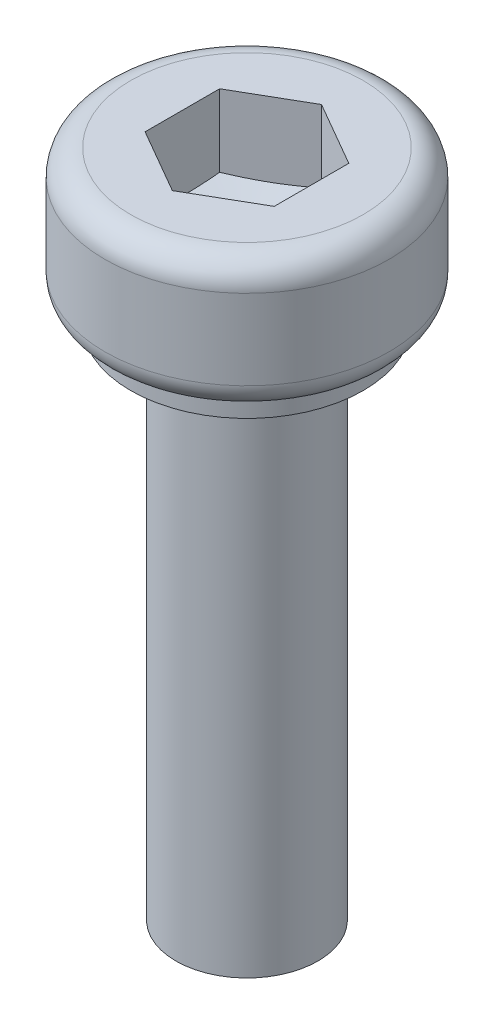
ISO-10303-21;
HEADER;
FILE_DESCRIPTION(('STEP AP214'),'2;1');
FILE_NAME('part.step','',(''),(''),'','','');
FILE_SCHEMA(('AUTOMOTIVE_DESIGN { 1 0 10303 214 1 1 1 1 }'));
ENDSEC;
DATA;
#1=APPLICATION_CONTEXT('core data for automotive mechanical design processes');
#2=APPLICATION_PROTOCOL_DEFINITION('international standard','automotive_design',2000,#1);
#3=PRODUCT_CONTEXT('',#1,'mechanical');
#4=PRODUCT('Part','Part','',(#3));
#5=PRODUCT_RELATED_PRODUCT_CATEGORY('part','',(#4));
#6=PRODUCT_DEFINITION_FORMATION('','',#4);
#7=PRODUCT_DEFINITION_CONTEXT('part definition',#1,'design');
#8=PRODUCT_DEFINITION('design','',#6,#7);
#9=PRODUCT_DEFINITION_SHAPE('','',#8);
#10=(LENGTH_UNIT() NAMED_UNIT(*) SI_UNIT(.MILLI.,.METRE.));
#11=(NAMED_UNIT(*) PLANE_ANGLE_UNIT() SI_UNIT($,.RADIAN.));
#12=(NAMED_UNIT(*) SI_UNIT($,.STERADIAN.) SOLID_ANGLE_UNIT());
#13=UNCERTAINTY_MEASURE_WITH_UNIT(LENGTH_MEASURE(1.E-05),#10,'distance_accuracy_value','');
#14=(GEOMETRIC_REPRESENTATION_CONTEXT(3) GLOBAL_UNCERTAINTY_ASSIGNED_CONTEXT((#13)) GLOBAL_UNIT_ASSIGNED_CONTEXT((#10,
#11,#12)) REPRESENTATION_CONTEXT('',''));
#15=CARTESIAN_POINT('',(0.,0.,0.));
#16=DIRECTION('',(0.,0.,1.));
#17=DIRECTION('',(1.,0.,0.));
#18=AXIS2_PLACEMENT_3D('',#15,#16,#17);
#19=CARTESIAN_POINT('',(0.,6.475,0.));
#20=DIRECTION('',(0.,-1.,0.));
#21=DIRECTION('',(0.,0.,-1.));
#22=AXIS2_PLACEMENT_3D('',#19,#20,#21);
#23=PLANE('',#22);
#24=DIRECTION('',(-0.866025403784439,0.,0.5));
#25=VECTOR('',#24,1.);
#26=CARTESIAN_POINT('',(0.,6.475,-1.44337567297406));
#27=LINE('',#26,#25);
#28=CARTESIAN_POINT('',(0.,6.475,-1.44337567297406));
#29=VERTEX_POINT('',#28);
#30=CARTESIAN_POINT('',(-1.25,6.475,-0.721687836487033));
#31=VERTEX_POINT('',#30);
#32=EDGE_CURVE('E215',#29,#31,#27,.T.);
#33=ORIENTED_EDGE('',*,*,#32,.F.);
#34=DIRECTION('',(-0.866025403784439,0.,-0.5));
#35=VECTOR('',#34,1.);
#36=CARTESIAN_POINT('',(1.25,6.475,-0.721687836487033));
#37=LINE('',#36,#35);
#38=CARTESIAN_POINT('',(1.25,6.475,-0.721687836487033));
#39=VERTEX_POINT('',#38);
#40=EDGE_CURVE('E64',#39,#29,#37,.T.);
#41=ORIENTED_EDGE('',*,*,#40,.F.);
#42=DIRECTION('',(0.,0.,-1.));
#43=VECTOR('',#42,1.);
#44=CARTESIAN_POINT('',(1.25,6.475,0.721687836487033));
#45=LINE('',#44,#43);
#46=CARTESIAN_POINT('',(1.25,6.475,0.721687836487033));
#47=VERTEX_POINT('',#46);
#48=EDGE_CURVE('E126',#47,#39,#45,.T.);
#49=ORIENTED_EDGE('',*,*,#48,.F.);
#50=DIRECTION('',(0.866025403784439,0.,-0.5));
#51=VECTOR('',#50,1.);
#52=CARTESIAN_POINT('',(0.,6.475,1.44337567297406));
#53=LINE('',#52,#51);
#54=CARTESIAN_POINT('',(0.,6.475,1.44337567297406));
#55=VERTEX_POINT('',#54);
#56=EDGE_CURVE('E133',#55,#47,#53,.T.);
#57=ORIENTED_EDGE('',*,*,#56,.F.);
#58=DIRECTION('',(0.866025403784439,0.,0.5));
#59=VECTOR('',#58,1.);
#60=CARTESIAN_POINT('',(-1.25,6.475,0.721687836487033));
#61=LINE('',#60,#59);
#62=CARTESIAN_POINT('',(-1.25,6.475,0.721687836487033));
#63=VERTEX_POINT('',#62);
#64=EDGE_CURVE('E392',#63,#55,#61,.T.);
#65=ORIENTED_EDGE('',*,*,#64,.F.);
#66=DIRECTION('',(0.,0.,1.));
#67=VECTOR('',#66,1.);
#68=CARTESIAN_POINT('',(-1.25,6.475,-0.721687836487033));
#69=LINE('',#68,#67);
#70=EDGE_CURVE('E406',#31,#63,#69,.T.);
#71=ORIENTED_EDGE('',*,*,#70,.F.);
#72=EDGE_LOOP('',(#33,#41,#49,#57,#65,#71));
#73=FACE_BOUND('',#72,.T.);
#74=CARTESIAN_POINT('',(0.,6.475,0.));
#75=DIRECTION('',(0.,1.,0.));
#76=DIRECTION('',(0.,0.,1.));
#77=AXIS2_PLACEMENT_3D('',#74,#75,#76);
#78=CIRCLE('',#77,2.25);
#79=CARTESIAN_POINT('',(0.,6.475,2.25));
#80=VERTEX_POINT('',#79);
#81=EDGE_CURVE('E11',#80,#80,#78,.T.);
#82=ORIENTED_EDGE('',*,*,#81,.T.);
#83=EDGE_LOOP('',(#82));
#84=FACE_BOUND('',#83,.T.);
#85=ADVANCED_FACE('F49',(#73,#84),#23,.F.);
#86=CARTESIAN_POINT('',(0.,5.975,0.));
#87=DIRECTION('',(0.,1.,0.));
#88=DIRECTION('',(0.,0.,1.));
#89=AXIS2_PLACEMENT_3D('',#86,#87,#88);
#90=TOROIDAL_SURFACE('',#89,2.25,0.5);
#91=ORIENTED_EDGE('',*,*,#81,.F.);
#92=EDGE_LOOP('',(#91));
#93=FACE_BOUND('',#92,.T.);
#94=CARTESIAN_POINT('',(0.,5.975,0.));
#95=DIRECTION('',(0.,1.,0.));
#96=DIRECTION('',(0.,0.,1.));
#97=AXIS2_PLACEMENT_3D('',#94,#95,#96);
#98=CIRCLE('',#97,2.75);
#99=CARTESIAN_POINT('',(0.,5.975,2.75));
#100=VERTEX_POINT('',#99);
#101=EDGE_CURVE('E57',#100,#100,#98,.T.);
#102=ORIENTED_EDGE('',*,*,#101,.T.);
#103=EDGE_LOOP('',(#102));
#104=FACE_BOUND('',#103,.T.);
#105=ADVANCED_FACE('F206',(#93,#104),#90,.T.);
#106=CARTESIAN_POINT('',(0.,4.09422492401216,0.));
#107=DIRECTION('',(0.,1.,0.));
#108=DIRECTION('',(0.,0.,1.));
#109=AXIS2_PLACEMENT_3D('',#106,#107,#108);
#110=CYLINDRICAL_SURFACE('',#109,2.75);
#111=ORIENTED_EDGE('',*,*,#101,.F.);
#112=EDGE_LOOP('',(#111));
#113=FACE_BOUND('',#112,.T.);
#114=CARTESIAN_POINT('',(0.,4.425,0.));
#115=DIRECTION('',(0.,1.,0.));
#116=DIRECTION('',(0.,0.,1.));
#117=AXIS2_PLACEMENT_3D('',#114,#115,#116);
#118=CIRCLE('',#117,2.75);
#119=CARTESIAN_POINT('',(0.,4.425,2.75));
#120=VERTEX_POINT('',#119);
#121=EDGE_CURVE('E222',#120,#120,#118,.T.);
#122=ORIENTED_EDGE('',*,*,#121,.T.);
#123=EDGE_LOOP('',(#122));
#124=FACE_BOUND('',#123,.T.);
#125=ADVANCED_FACE('F211',(#113,#124),#110,.T.);
#126=CARTESIAN_POINT('',(0.,4.425,0.));
#127=DIRECTION('',(0.,1.,0.));
#128=DIRECTION('',(0.,0.,1.));
#129=AXIS2_PLACEMENT_3D('',#126,#127,#128);
#130=TOROIDAL_SURFACE('',#129,2.25,0.5);
#131=ORIENTED_EDGE('',*,*,#121,.F.);
#132=EDGE_LOOP('',(#131));
#133=FACE_BOUND('',#132,.T.);
#134=CARTESIAN_POINT('',(0.,3.925,0.));
#135=DIRECTION('',(0.,1.,0.));
#136=DIRECTION('',(0.,0.,1.));
#137=AXIS2_PLACEMENT_3D('',#134,#135,#136);
#138=CIRCLE('',#137,2.25);
#139=CARTESIAN_POINT('',(0.,3.925,2.25));
#140=VERTEX_POINT('',#139);
#141=EDGE_CURVE('E225',#140,#140,#138,.T.);
#142=ORIENTED_EDGE('',*,*,#141,.T.);
#143=EDGE_LOOP('',(#142));
#144=FACE_BOUND('',#143,.T.);
#145=ADVANCED_FACE('F262',(#133,#144),#130,.T.);
#146=CARTESIAN_POINT('',(0.,4.09422492401216,0.));
#147=DIRECTION('',(0.,1.,0.));
#148=DIRECTION('',(0.,0.,1.));
#149=AXIS2_PLACEMENT_3D('',#146,#147,#148);
#150=CYLINDRICAL_SURFACE('',#149,2.25);
#151=ORIENTED_EDGE('',*,*,#141,.F.);
#152=EDGE_LOOP('',(#151));
#153=FACE_BOUND('',#152,.T.);
#154=CARTESIAN_POINT('',(0.,3.525,0.));
#155=DIRECTION('',(0.,1.,0.));
#156=DIRECTION('',(0.,0.,1.));
#157=AXIS2_PLACEMENT_3D('',#154,#155,#156);
#158=CIRCLE('',#157,2.25);
#159=CARTESIAN_POINT('',(0.,3.525,2.25));
#160=VERTEX_POINT('',#159);
#161=EDGE_CURVE('E231',#160,#160,#158,.T.);
#162=ORIENTED_EDGE('',*,*,#161,.T.);
#163=EDGE_LOOP('',(#162));
#164=FACE_BOUND('',#163,.T.);
#165=ADVANCED_FACE('F258',(#153,#164),#150,.T.);
#166=CARTESIAN_POINT('',(2.25,3.525,0.));
#167=DIRECTION('',(0.,1.,0.));
#168=DIRECTION('',(0.,0.,1.));
#169=AXIS2_PLACEMENT_3D('',#166,#167,#168);
#170=PLANE('',#169);
#171=ORIENTED_EDGE('',*,*,#161,.F.);
#172=EDGE_LOOP('',(#171));
#173=FACE_BOUND('',#172,.T.);
#174=CARTESIAN_POINT('',(0.,3.525,0.));
#175=DIRECTION('',(0.,1.,0.));
#176=DIRECTION('',(0.,0.,1.));
#177=AXIS2_PLACEMENT_3D('',#174,#175,#176);
#178=CIRCLE('',#177,1.375);
#179=CARTESIAN_POINT('',(0.,3.525,1.375));
#180=VERTEX_POINT('',#179);
#181=EDGE_CURVE('E234',#180,#180,#178,.T.);
#182=ORIENTED_EDGE('',*,*,#181,.T.);
#183=EDGE_LOOP('',(#182));
#184=FACE_BOUND('',#183,.T.);
#185=ADVANCED_FACE('F251',(#173,#184),#170,.F.);
#186=CARTESIAN_POINT('',(0.,4.09422492401216,0.));
#187=DIRECTION('',(0.,1.,0.));
#188=DIRECTION('',(0.,0.,1.));
#189=AXIS2_PLACEMENT_3D('',#186,#187,#188);
#190=CYLINDRICAL_SURFACE('',#189,1.375);
#191=ORIENTED_EDGE('',*,*,#181,.F.);
#192=EDGE_LOOP('',(#191));
#193=FACE_BOUND('',#192,.T.);
#194=CARTESIAN_POINT('',(0.,-6.475,0.));
#195=DIRECTION('',(0.,1.,0.));
#196=DIRECTION('',(0.,0.,1.));
#197=AXIS2_PLACEMENT_3D('',#194,#195,#196);
#198=CIRCLE('',#197,1.375);
#199=CARTESIAN_POINT('',(0.,-6.475,1.375));
#200=VERTEX_POINT('',#199);
#201=EDGE_CURVE('E112',#200,#200,#198,.T.);
#202=ORIENTED_EDGE('',*,*,#201,.T.);
#203=EDGE_LOOP('',(#202));
#204=FACE_BOUND('',#203,.T.);
#205=ADVANCED_FACE('F243',(#193,#204),#190,.T.);
#206=CARTESIAN_POINT('',(1.375,-6.475,0.));
#207=DIRECTION('',(0.,1.,0.));
#208=DIRECTION('',(0.,0.,1.));
#209=AXIS2_PLACEMENT_3D('',#206,#207,#208);
#210=PLANE('',#209);
#211=ORIENTED_EDGE('',*,*,#201,.F.);
#212=EDGE_LOOP('',(#211));
#213=FACE_BOUND('',#212,.T.);
#214=ADVANCED_FACE('F245',(#213),#210,.F.);
#215=CARTESIAN_POINT('',(1.25,4.475,-0.721687836487033));
#216=DIRECTION('',(0.5,0.,-0.866025403784439));
#217=DIRECTION('',(-0.866025403784439,0.,-0.5));
#218=AXIS2_PLACEMENT_3D('',#215,#216,#217);
#219=PLANE('',#218);
#220=CARTESIAN_POINT('',(-0.000199999999999668,5.07502213659224,-1.4434911430279));
#221=CARTESIAN_POINT('',(0.0518104295641314,5.06926246143579,-1.41346290751838));
#222=CARTESIAN_POINT('',(0.103869536937207,5.06403974723522,-1.38340656786277));
#223=CARTESIAN_POINT('',(0.208081999228772,5.05487120303171,-1.32323947470582));
#224=CARTESIAN_POINT('',(0.260235371100698,5.05092563186542,-1.29312871141642));
#225=CARTESIAN_POINT('',(0.364473709342653,5.04452533628279,-1.23294667877254));
#226=CARTESIAN_POINT('',(0.416558490077755,5.04206668415272,-1.20287551659445));
#227=CARTESIAN_POINT('',(0.520762183051685,5.03877043652459,-1.1427134864054));
#228=CARTESIAN_POINT('',(0.572881091525842,5.03793268513289,-1.11262262056797));
#229=CARTESIAN_POINT('',(0.677118908474158,5.03793268513289,-1.05244088889312));
#230=CARTESIAN_POINT('',(0.729237816948315,5.03877043652459,-1.0223500230557));
#231=CARTESIAN_POINT('',(0.833441509922245,5.04206668415272,-0.962187992866649));
#232=CARTESIAN_POINT('',(0.885526290657347,5.04452533628279,-0.932116830688555));
#233=CARTESIAN_POINT('',(0.989764628899303,5.05092563186542,-0.871934798044683));
#234=CARTESIAN_POINT('',(1.04191800077123,5.05487120303171,-0.84182403475528));
#235=CARTESIAN_POINT('',(1.14613046306279,5.06403974723522,-0.781656941598331));
#236=CARTESIAN_POINT('',(1.19818957043587,5.06926246143579,-0.751600601942714));
#237=CARTESIAN_POINT('',(1.2502,5.07502213659224,-0.721572366433195));
#238=B_SPLINE_CURVE_WITH_KNOTS('',3,(#220,#221,#222,#223,#224,#225,#226,#227,#228,#229,#230,
#231,#232,#233,#234,#235,#236,#237),.UNSPECIFIED.,.F.,.F.,(4,2,2,2,2,2,2,2,4),(0.,
0.181000745388271,0.362038150988405,0.542595231362164,0.723134945402974,0.903674659443784,
1.08423173981754,1.26526914541768,1.44626989080595),.UNSPECIFIED.);
#239=CARTESIAN_POINT('',(0.,5.075,-1.44337567297406));
#240=VERTEX_POINT('',#239);
#241=CARTESIAN_POINT('',(1.25,5.075,-0.721687836487033));
#242=VERTEX_POINT('',#241);
#243=EDGE_CURVE('E116',#240,#242,#238,.T.);
#244=ORIENTED_EDGE('',*,*,#243,.T.);
#245=DIRECTION('',(0.,1.,0.));
#246=VECTOR('',#245,1.);
#247=CARTESIAN_POINT('',(1.25,4.475,-0.721687836487033));
#248=LINE('',#247,#246);
#249=EDGE_CURVE('E113',#242,#39,#248,.T.);
#250=ORIENTED_EDGE('',*,*,#249,.T.);
#251=ORIENTED_EDGE('',*,*,#40,.T.);
#252=DIRECTION('',(0.,1.,0.));
#253=VECTOR('',#252,1.);
#254=CARTESIAN_POINT('',(0.,4.475,-1.44337567297406));
#255=LINE('',#254,#253);
#256=EDGE_CURVE('E107',#240,#29,#255,.T.);
#257=ORIENTED_EDGE('',*,*,#256,.F.);
#258=EDGE_LOOP('',(#244,#250,#251,#257));
#259=FACE_BOUND('',#258,.T.);
#260=ADVANCED_FACE('F124',(#259),#219,.F.);
#261=CARTESIAN_POINT('',(1.25,4.475,0.721687836487033));
#262=DIRECTION('',(1.,0.,0.));
#263=DIRECTION('',(0.,0.,-1.));
#264=AXIS2_PLACEMENT_3D('',#261,#262,#263);
#265=PLANE('',#264);
#266=CARTESIAN_POINT('',(1.25,5.27986393266067,-2.17905403611333));
#267=CARTESIAN_POINT('',(1.25,5.26241167422932,-2.07395009860659));
#268=CARTESIAN_POINT('',(1.25,5.24522032681984,-1.96879996781174));
#269=CARTESIAN_POINT('',(1.25,5.21170531820386,-1.75835059041696));
#270=CARTESIAN_POINT('',(1.25,5.1953817490476,-1.65305132920933));
#271=CARTESIAN_POINT('',(1.25,5.16387651632622,-1.44176294489903));
#272=CARTESIAN_POINT('',(1.25,5.14870071461258,-1.33577293769499));
#273=CARTESIAN_POINT('',(1.25,5.12016928542285,-1.12353979169023));
#274=CARTESIAN_POINT('',(1.25,5.10681373080935,-1.01729664292962));
#275=CARTESIAN_POINT('',(1.25,5.08296213919631,-0.806005172192662));
#276=CARTESIAN_POINT('',(1.25,5.0724282853726,-0.700961236680109));
#277=CARTESIAN_POINT('',(1.25,5.05508287381984,-0.490567790876244));
#278=CARTESIAN_POINT('',(1.25,5.04827077429862,-0.385218327307928));
#279=CARTESIAN_POINT('',(1.25,5.03946010519578,-0.17454649009671));
#280=CARTESIAN_POINT('',(1.25,5.03745059762555,-0.069224602200226));
#281=CARTESIAN_POINT('',(1.25,5.03861439807437,0.141392413524245));
#282=CARTESIAN_POINT('',(1.25,5.04178784167731,0.246687540580112));
#283=CARTESIAN_POINT('',(1.25,5.0511996283626,0.428094047279161));
#284=CARTESIAN_POINT('',(1.25,5.05635479919092,0.504266022940998));
#285=CARTESIAN_POINT('',(1.25,5.06864181101614,0.656446776567247));
#286=CARTESIAN_POINT('',(1.25,5.0757736272437,0.732455556564635));
#287=CARTESIAN_POINT('',(1.25,5.09949527042362,0.960485133272154));
#288=CARTESIAN_POINT('',(1.25,5.11839567377015,1.11226253619117));
#289=CARTESIAN_POINT('',(1.25,5.14949527165966,1.34036100724888));
#290=CARTESIAN_POINT('',(1.25,5.16038509955885,1.41687238761891));
#291=CARTESIAN_POINT('',(1.25,5.18286077200284,1.56979468542722));
#292=CARTESIAN_POINT('',(1.25,5.19444662073168,1.64620560225877));
#293=CARTESIAN_POINT('',(1.25,5.21810928108022,1.7987279380359));
#294=CARTESIAN_POINT('',(1.25,5.23018460256629,1.87483959068598));
#295=CARTESIAN_POINT('',(1.25,5.25474485969705,2.02699389967147));
#296=CARTESIAN_POINT('',(1.25,5.26722977968569,2.10303655853011));
#297=CARTESIAN_POINT('',(1.25,5.27986393266067,2.17905403611333));
#298=B_SPLINE_CURVE_WITH_KNOTS('',3,(#266,#267,#268,#269,#270,#271,#272,#273,#274,#275,#276,
#277,#278,#279,#280,#281,#282,#283,#284,#285,#286,#287,#288,#289,#290,#291,#292,#293,#294,#295,
#296,#297),.UNSPECIFIED.,.F.,.F.,(4,2,2,2,2,2,2,2,2,2,2,2,2,2,2,4),(0.,0.319633094293302,
0.639300026536295,0.960502494708345,1.28171781650624,1.59838422210634,1.91500451689018,
2.23090301324148,2.54680977350041,2.77582029179633,3.00482794049193,3.46358394927292,
3.69543178901939,3.92728102262634,4.15847082499727,4.38965180089788),.UNSPECIFIED.);
#299=CARTESIAN_POINT('',(1.25,5.075,0.721687836487033));
#300=VERTEX_POINT('',#299);
#301=EDGE_CURVE('E120',#242,#300,#298,.T.);
#302=ORIENTED_EDGE('',*,*,#301,.T.);
#303=DIRECTION('',(0.,1.,0.));
#304=VECTOR('',#303,1.);
#305=CARTESIAN_POINT('',(1.25,4.475,0.721687836487033));
#306=LINE('',#305,#304);
#307=EDGE_CURVE('E390',#300,#47,#306,.T.);
#308=ORIENTED_EDGE('',*,*,#307,.T.);
#309=ORIENTED_EDGE('',*,*,#48,.T.);
#310=ORIENTED_EDGE('',*,*,#249,.F.);
#311=EDGE_LOOP('',(#302,#308,#309,#310));
#312=FACE_BOUND('',#311,.T.);
#313=ADVANCED_FACE('F188',(#312),#265,.F.);
#314=CARTESIAN_POINT('',(0.,4.475,1.44337567297406));
#315=DIRECTION('',(0.5,0.,0.866025403784439));
#316=DIRECTION('',(0.866025403784439,0.,-0.5));
#317=AXIS2_PLACEMENT_3D('',#314,#315,#316);
#318=PLANE('',#317);
#319=CARTESIAN_POINT('',(1.2502,5.07502213659224,0.721572366433195));
#320=CARTESIAN_POINT('',(1.19818957043587,5.06926246143579,0.751600601942714));
#321=CARTESIAN_POINT('',(1.14613046306279,5.06403974723522,0.781656941598331));
#322=CARTESIAN_POINT('',(1.04191800077123,5.05487120303171,0.84182403475528));
#323=CARTESIAN_POINT('',(0.989764628899303,5.05092563186542,0.871934798044683));
#324=CARTESIAN_POINT('',(0.885526290657347,5.04452533628279,0.932116830688555));
#325=CARTESIAN_POINT('',(0.833441509922245,5.04206668415272,0.962187992866649));
#326=CARTESIAN_POINT('',(0.729237816948315,5.03877043652459,1.0223500230557));
#327=CARTESIAN_POINT('',(0.677118908474157,5.03793268513289,1.05244088889312));
#328=CARTESIAN_POINT('',(0.572881091525842,5.03793268513289,1.11262262056797));
#329=CARTESIAN_POINT('',(0.520762183051684,5.03877043652459,1.1427134864054));
#330=CARTESIAN_POINT('',(0.416558490077755,5.04206668415272,1.20287551659445));
#331=CARTESIAN_POINT('',(0.364473709342653,5.04452533628279,1.23294667877254));
#332=CARTESIAN_POINT('',(0.260235371100697,5.05092563186542,1.29312871141642));
#333=CARTESIAN_POINT('',(0.208081999228772,5.05487120303171,1.32323947470582));
#334=CARTESIAN_POINT('',(0.103869536937207,5.06403974723522,1.38340656786277));
#335=CARTESIAN_POINT('',(0.0518104295641309,5.06926246143579,1.41346290751838));
#336=CARTESIAN_POINT('',(-0.000200000000000036,5.07502213659224,1.4434911430279));
#337=B_SPLINE_CURVE_WITH_KNOTS('',3,(#319,#320,#321,#322,#323,#324,#325,#326,#327,#328,#329,
#330,#331,#332,#333,#334,#335,#336),.UNSPECIFIED.,.F.,.F.,(4,2,2,2,2,2,2,2,4),(0.,
0.181000745388271,0.362038150988405,0.542595231362164,0.723134945402974,0.903674659443784,
1.08423173981754,1.26526914541768,1.44626989080595),.UNSPECIFIED.);
#338=CARTESIAN_POINT('',(0.,5.075,1.44337567297406));
#339=VERTEX_POINT('',#338);
#340=EDGE_CURVE('E171',#300,#339,#337,.T.);
#341=ORIENTED_EDGE('',*,*,#340,.T.);
#342=DIRECTION('',(0.,1.,0.));
#343=VECTOR('',#342,1.);
#344=CARTESIAN_POINT('',(0.,4.475,1.44337567297406));
#345=LINE('',#344,#343);
#346=EDGE_CURVE('E388',#339,#55,#345,.T.);
#347=ORIENTED_EDGE('',*,*,#346,.T.);
#348=ORIENTED_EDGE('',*,*,#56,.T.);
#349=ORIENTED_EDGE('',*,*,#307,.F.);
#350=EDGE_LOOP('',(#341,#347,#348,#349));
#351=FACE_BOUND('',#350,.T.);
#352=ADVANCED_FACE('F191',(#351),#318,.F.);
#353=CARTESIAN_POINT('',(-1.25,4.475,0.721687836487033));
#354=DIRECTION('',(-0.5,0.,0.866025403784439));
#355=DIRECTION('',(0.866025403784439,0.,0.5));
#356=AXIS2_PLACEMENT_3D('',#353,#354,#355);
#357=PLANE('',#356);
#358=CARTESIAN_POINT('',(0.000199999999999786,5.07502213659224,1.4434911430279));
#359=CARTESIAN_POINT('',(-0.0518104295641313,5.06926246143579,1.41346290751838));
#360=CARTESIAN_POINT('',(-0.103869536937207,5.06403974723522,1.38340656786277));
#361=CARTESIAN_POINT('',(-0.208081999228772,5.05487120303171,1.32323947470582));
#362=CARTESIAN_POINT('',(-0.260235371100697,5.05092563186542,1.29312871141641));
#363=CARTESIAN_POINT('',(-0.364473709342653,5.04452533628279,1.23294667877254));
#364=CARTESIAN_POINT('',(-0.416558490077755,5.04206668415272,1.20287551659445));
#365=CARTESIAN_POINT('',(-0.520762183051685,5.03877043652459,1.1427134864054));
#366=CARTESIAN_POINT('',(-0.572881091525842,5.03793268513289,1.11262262056797));
#367=CARTESIAN_POINT('',(-0.677118908474158,5.03793268513289,1.05244088889312));
#368=CARTESIAN_POINT('',(-0.729237816948315,5.03877043652459,1.0223500230557));
#369=CARTESIAN_POINT('',(-0.833441509922245,5.04206668415272,0.962187992866648));
#370=CARTESIAN_POINT('',(-0.885526290657347,5.04452533628279,0.932116830688555));
#371=CARTESIAN_POINT('',(-0.989764628899303,5.05092563186542,0.871934798044682));
#372=CARTESIAN_POINT('',(-1.04191800077123,5.05487120303171,0.84182403475528));
#373=CARTESIAN_POINT('',(-1.14613046306279,5.06403974723522,0.781656941598331));
#374=CARTESIAN_POINT('',(-1.19818957043587,5.06926246143579,0.751600601942714));
#375=CARTESIAN_POINT('',(-1.2502,5.07502213659224,0.721572366433195));
#376=B_SPLINE_CURVE_WITH_KNOTS('',3,(#358,#359,#360,#361,#362,#363,#364,#365,#366,#367,#368,
#369,#370,#371,#372,#373,#374,#375),.UNSPECIFIED.,.F.,.F.,(4,2,2,2,2,2,2,2,4),(0.,
0.181000745388271,0.362038150988405,0.542595231362164,0.723134945402974,0.903674659443784,
1.08423173981754,1.26526914541768,1.44626989080595),.UNSPECIFIED.);
#377=CARTESIAN_POINT('',(-1.25,5.075,0.721687836487033));
#378=VERTEX_POINT('',#377);
#379=EDGE_CURVE('E164',#339,#378,#376,.T.);
#380=ORIENTED_EDGE('',*,*,#379,.T.);
#381=DIRECTION('',(0.,1.,0.));
#382=VECTOR('',#381,1.);
#383=CARTESIAN_POINT('',(-1.25,4.475,0.721687836487033));
#384=LINE('',#383,#382);
#385=EDGE_CURVE('E130',#378,#63,#384,.T.);
#386=ORIENTED_EDGE('',*,*,#385,.T.);
#387=ORIENTED_EDGE('',*,*,#64,.T.);
#388=ORIENTED_EDGE('',*,*,#346,.F.);
#389=EDGE_LOOP('',(#380,#386,#387,#388));
#390=FACE_BOUND('',#389,.T.);
#391=ADVANCED_FACE('F195',(#390),#357,.F.);
#392=CARTESIAN_POINT('',(-1.25,4.475,-0.721687836487033));
#393=DIRECTION('',(-1.,0.,0.));
#394=DIRECTION('',(0.,0.,1.));
#395=AXIS2_PLACEMENT_3D('',#392,#393,#394);
#396=PLANE('',#395);
#397=CARTESIAN_POINT('',(-1.25,5.27986393266067,2.17905403611333));
#398=CARTESIAN_POINT('',(-1.25,5.26241167422932,2.07395009860659));
#399=CARTESIAN_POINT('',(-1.25,5.24522032681984,1.96879996781174));
#400=CARTESIAN_POINT('',(-1.25,5.21170531820386,1.75835059041696));
#401=CARTESIAN_POINT('',(-1.25,5.1953817490476,1.65305132920933));
#402=CARTESIAN_POINT('',(-1.25,5.16387651632622,1.44176294489903));
#403=CARTESIAN_POINT('',(-1.25,5.14870071461258,1.33577293769499));
#404=CARTESIAN_POINT('',(-1.25,5.12016928542285,1.12353979169023));
#405=CARTESIAN_POINT('',(-1.25,5.10681373080935,1.01729664292962));
#406=CARTESIAN_POINT('',(-1.25,5.08296213919631,0.806005172192661));
#407=CARTESIAN_POINT('',(-1.25,5.0724282853726,0.700961236680109));
#408=CARTESIAN_POINT('',(-1.25,5.05508287381984,0.490567790876243));
#409=CARTESIAN_POINT('',(-1.25,5.04827077429862,0.385218327307928));
#410=CARTESIAN_POINT('',(-1.25,5.03946010519578,0.17454649009671));
#411=CARTESIAN_POINT('',(-1.25,5.03745059762555,0.0692246022002256));
#412=CARTESIAN_POINT('',(-1.25,5.03861439807437,-0.141392413524246));
#413=CARTESIAN_POINT('',(-1.25,5.04178784167731,-0.246687540580112));
#414=CARTESIAN_POINT('',(-1.25,5.0511996283626,-0.428094047279161));
#415=CARTESIAN_POINT('',(-1.25,5.05635479919092,-0.504266022940999));
#416=CARTESIAN_POINT('',(-1.25,5.06864181101614,-0.656446776567247));
#417=CARTESIAN_POINT('',(-1.25,5.0757736272437,-0.732455556564635));
#418=CARTESIAN_POINT('',(-1.25,5.09949527042362,-0.960485133272153));
#419=CARTESIAN_POINT('',(-1.25,5.11839567377015,-1.11226253619117));
#420=CARTESIAN_POINT('',(-1.25,5.14949527165966,-1.34036100724888));
#421=CARTESIAN_POINT('',(-1.25,5.16038509955885,-1.41687238761891));
#422=CARTESIAN_POINT('',(-1.25,5.18286077200284,-1.56979468542722));
#423=CARTESIAN_POINT('',(-1.25,5.19444662073168,-1.64620560225877));
#424=CARTESIAN_POINT('',(-1.25,5.21810928108022,-1.7987279380359));
#425=CARTESIAN_POINT('',(-1.25,5.23018460256629,-1.87483959068598));
#426=CARTESIAN_POINT('',(-1.25,5.25474485969705,-2.02699389967147));
#427=CARTESIAN_POINT('',(-1.25,5.26722977968569,-2.10303655853011));
#428=CARTESIAN_POINT('',(-1.25,5.27986393266067,-2.17905403611333));
#429=B_SPLINE_CURVE_WITH_KNOTS('',3,(#397,#398,#399,#400,#401,#402,#403,#404,#405,#406,#407,
#408,#409,#410,#411,#412,#413,#414,#415,#416,#417,#418,#419,#420,#421,#422,#423,#424,#425,#426,
#427,#428),.UNSPECIFIED.,.F.,.F.,(4,2,2,2,2,2,2,2,2,2,2,2,2,2,2,4),(0.,0.319633094293302,
0.639300026536295,0.960502494708344,1.28171781650624,1.59838422210634,1.91500451689018,
2.23090301324148,2.54680977350041,2.77582029179633,3.00482794049193,3.46358394927292,
3.69543178901939,3.92728102262634,4.15847082499726,4.38965180089787),.UNSPECIFIED.);
#430=CARTESIAN_POINT('',(-1.25,5.075,-0.721687836487033));
#431=VERTEX_POINT('',#430);
#432=EDGE_CURVE('E72',#378,#431,#429,.T.);
#433=ORIENTED_EDGE('',*,*,#432,.T.);
#434=DIRECTION('',(0.,1.,0.));
#435=VECTOR('',#434,1.);
#436=CARTESIAN_POINT('',(-1.25,4.475,-0.721687836487033));
#437=LINE('',#436,#435);
#438=EDGE_CURVE('E109',#431,#31,#437,.T.);
#439=ORIENTED_EDGE('',*,*,#438,.T.);
#440=ORIENTED_EDGE('',*,*,#70,.T.);
#441=ORIENTED_EDGE('',*,*,#385,.F.);
#442=EDGE_LOOP('',(#433,#439,#440,#441));
#443=FACE_BOUND('',#442,.T.);
#444=ADVANCED_FACE('F199',(#443),#396,.F.);
#445=CARTESIAN_POINT('',(0.,4.475,-1.44337567297406));
#446=DIRECTION('',(-0.5,0.,-0.866025403784439));
#447=DIRECTION('',(-0.866025403784439,0.,0.5));
#448=AXIS2_PLACEMENT_3D('',#445,#446,#447);
#449=PLANE('',#448);
#450=CARTESIAN_POINT('',(-1.2502,5.07502213659224,-0.721572366433195));
#451=CARTESIAN_POINT('',(-1.19818957043587,5.06926246143579,-0.751600601942714));
#452=CARTESIAN_POINT('',(-1.14613046306279,5.06403974723522,-0.781656941598331));
#453=CARTESIAN_POINT('',(-1.04191800077123,5.05487120303171,-0.84182403475528));
#454=CARTESIAN_POINT('',(-0.989764628899302,5.05092563186542,-0.871934798044683));
#455=CARTESIAN_POINT('',(-0.885526290657347,5.04452533628279,-0.932116830688555));
#456=CARTESIAN_POINT('',(-0.833441509922245,5.04206668415272,-0.962187992866649));
#457=CARTESIAN_POINT('',(-0.729237816948315,5.03877043652459,-1.0223500230557));
#458=CARTESIAN_POINT('',(-0.677118908474157,5.03793268513289,-1.05244088889312));
#459=CARTESIAN_POINT('',(-0.572881091525842,5.03793268513289,-1.11262262056797));
#460=CARTESIAN_POINT('',(-0.520762183051684,5.03877043652459,-1.1427134864054));
#461=CARTESIAN_POINT('',(-0.416558490077755,5.04206668415272,-1.20287551659445));
#462=CARTESIAN_POINT('',(-0.364473709342652,5.04452533628279,-1.23294667877254));
#463=CARTESIAN_POINT('',(-0.260235371100697,5.05092563186542,-1.29312871141642));
#464=CARTESIAN_POINT('',(-0.208081999228772,5.05487120303171,-1.32323947470582));
#465=CARTESIAN_POINT('',(-0.103869536937206,5.06403974723522,-1.38340656786277));
#466=CARTESIAN_POINT('',(-0.0518104295641308,5.06926246143579,-1.41346290751838));
#467=CARTESIAN_POINT('',(0.00020000000000046,5.07502213659224,-1.4434911430279));
#468=B_SPLINE_CURVE_WITH_KNOTS('',3,(#450,#451,#452,#453,#454,#455,#456,#457,#458,#459,#460,
#461,#462,#463,#464,#465,#466,#467),.UNSPECIFIED.,.F.,.F.,(4,2,2,2,2,2,2,2,4),(0.,
0.181000745388271,0.362038150988405,0.542595231362164,0.723134945402975,0.903674659443785,
1.08423173981754,1.26526914541768,1.44626989080595),.UNSPECIFIED.);
#469=EDGE_CURVE('E103',#431,#240,#468,.T.);
#470=ORIENTED_EDGE('',*,*,#469,.T.);
#471=ORIENTED_EDGE('',*,*,#256,.T.);
#472=ORIENTED_EDGE('',*,*,#32,.T.);
#473=ORIENTED_EDGE('',*,*,#438,.F.);
#474=EDGE_LOOP('',(#470,#471,#472,#473));
#475=FACE_BOUND('',#474,.T.);
#476=ADVANCED_FACE('F105',(#475),#449,.F.);
#477=CARTESIAN_POINT('',(0.,4.875,0.));
#478=DIRECTION('',(0.,1.,0.));
#479=DIRECTION('',(0.,0.,1.));
#480=AXIS2_PLACEMENT_3D('',#477,#478,#479);
#481=PLANE('',#480);
#482=CARTESIAN_POINT('',(0.,4.875,0.));
#483=DIRECTION('',(0.,-1.,0.));
#484=DIRECTION('',(0.,0.,-1.));
#485=AXIS2_PLACEMENT_3D('',#482,#483,#484);
#486=CIRCLE('',#485,0.4);
#487=CARTESIAN_POINT('',(0.,4.875,-0.4));
#488=VERTEX_POINT('',#487);
#489=EDGE_CURVE('E379',#488,#488,#486,.T.);
#490=ORIENTED_EDGE('',*,*,#489,.F.);
#491=EDGE_LOOP('',(#490));
#492=FACE_BOUND('',#491,.T.);
#493=ADVANCED_FACE('F150',(#492),#481,.T.);
#494=CARTESIAN_POINT('',(0.,5.075,0.));
#495=DIRECTION('',(0.,1.,0.));
#496=DIRECTION('',(0.,0.,1.));
#497=AXIS2_PLACEMENT_3D('',#494,#495,#496);
#498=CONICAL_SURFACE('',#497,1.44337567297406,1.38140809939809);
#499=ORIENTED_EDGE('',*,*,#243,.F.);
#500=ORIENTED_EDGE('',*,*,#469,.F.);
#501=ORIENTED_EDGE('',*,*,#432,.F.);
#502=ORIENTED_EDGE('',*,*,#379,.F.);
#503=ORIENTED_EDGE('',*,*,#340,.F.);
#504=ORIENTED_EDGE('',*,*,#301,.F.);
#505=EDGE_LOOP('',(#499,#500,#501,#502,#503,#504));
#506=FACE_BOUND('',#505,.T.);
#507=ORIENTED_EDGE('',*,*,#489,.T.);
#508=EDGE_LOOP('',(#507));
#509=FACE_BOUND('',#508,.T.);
#510=ADVANCED_FACE('F117',(#506,#509),#498,.F.);
#511=CLOSED_SHELL('',(#85,#105,#125,#145,#165,#185,#205,#214,#260,#313,#352,#391,#444,#476,#493,#510));
#512=MANIFOLD_SOLID_BREP('B2',#511);
#513=ADVANCED_BREP_SHAPE_REPRESENTATION('',(#18,#512),#14);
#514=SHAPE_DEFINITION_REPRESENTATION(#9,#513);
ENDSEC;
END-ISO-10303-21;
